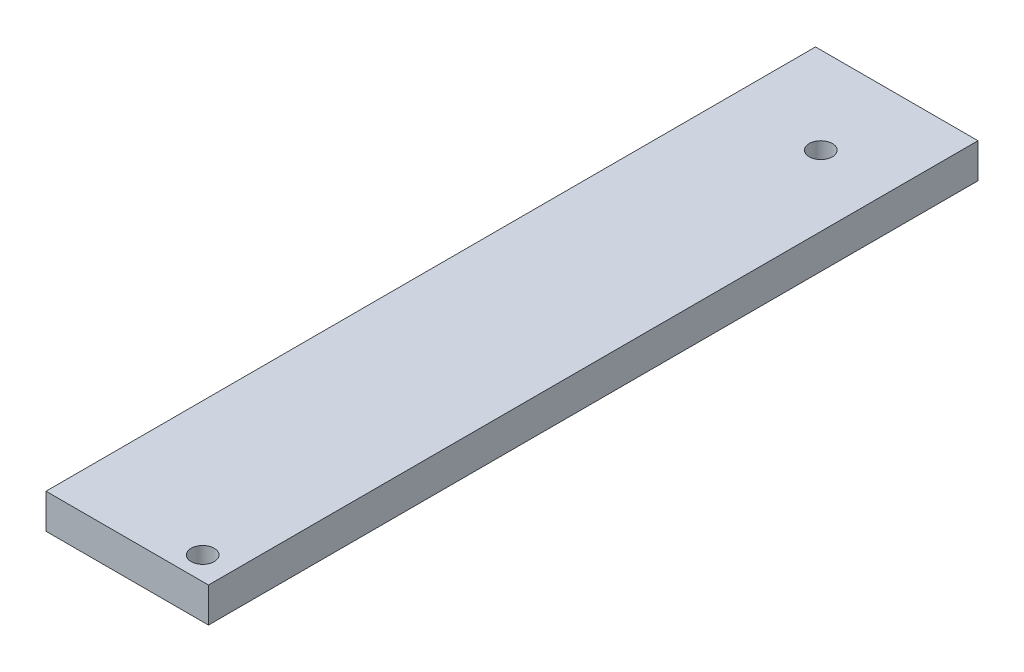
ISO-10303-21;
HEADER;
FILE_DESCRIPTION(('STEP AP214'),'2;1');
FILE_NAME('part.step','',(''),(''),'','','');
FILE_SCHEMA(('AUTOMOTIVE_DESIGN { 1 0 10303 214 1 1 1 1 }'));
ENDSEC;
DATA;
#1=APPLICATION_CONTEXT('core data for automotive mechanical design processes');
#2=APPLICATION_PROTOCOL_DEFINITION('international standard','automotive_design',2000,#1);
#3=PRODUCT_CONTEXT('',#1,'mechanical');
#4=PRODUCT('Part','Part','',(#3));
#5=PRODUCT_RELATED_PRODUCT_CATEGORY('part','',(#4));
#6=PRODUCT_DEFINITION_FORMATION('','',#4);
#7=PRODUCT_DEFINITION_CONTEXT('part definition',#1,'design');
#8=PRODUCT_DEFINITION('design','',#6,#7);
#9=PRODUCT_DEFINITION_SHAPE('','',#8);
#10=(LENGTH_UNIT() NAMED_UNIT(*) SI_UNIT(.MILLI.,.METRE.));
#11=(NAMED_UNIT(*) PLANE_ANGLE_UNIT() SI_UNIT($,.RADIAN.));
#12=(NAMED_UNIT(*) SI_UNIT($,.STERADIAN.) SOLID_ANGLE_UNIT());
#13=UNCERTAINTY_MEASURE_WITH_UNIT(LENGTH_MEASURE(1.E-05),#10,'distance_accuracy_value','');
#14=(GEOMETRIC_REPRESENTATION_CONTEXT(3) GLOBAL_UNCERTAINTY_ASSIGNED_CONTEXT((#13)) GLOBAL_UNIT_ASSIGNED_CONTEXT((#10,
#11,#12)) REPRESENTATION_CONTEXT('',''));
#15=CARTESIAN_POINT('',(0.,0.,0.));
#16=DIRECTION('',(0.,0.,1.));
#17=DIRECTION('',(1.,0.,0.));
#18=AXIS2_PLACEMENT_3D('',#15,#16,#17);
#19=CARTESIAN_POINT('',(11.6837837837838,6.,0.));
#20=DIRECTION('',(1.,0.,0.));
#21=DIRECTION('',(0.,0.,-1.));
#22=AXIS2_PLACEMENT_3D('',#19,#20,#21);
#23=PLANE('',#22);
#24=DIRECTION('',(0.,0.,1.));
#25=VECTOR('',#24,1.);
#26=CARTESIAN_POINT('',(11.6837837837838,0.,0.));
#27=LINE('',#26,#25);
#28=CARTESIAN_POINT('',(11.6837837837838,0.,-61.6054054054054));
#29=VERTEX_POINT('',#28);
#30=CARTESIAN_POINT('',(11.6837837837838,0.,71.3945945945946));
#31=VERTEX_POINT('',#30);
#32=EDGE_CURVE('E99',#29,#31,#27,.T.);
#33=ORIENTED_EDGE('',*,*,#32,.F.);
#34=DIRECTION('',(0.,-1.,0.));
#35=VECTOR('',#34,1.);
#36=CARTESIAN_POINT('',(11.6837837837838,6.,-61.6054054054054));
#37=LINE('',#36,#35);
#38=CARTESIAN_POINT('',(11.6837837837838,6.,-61.6054054054054));
#39=VERTEX_POINT('',#38);
#40=EDGE_CURVE('E11',#39,#29,#37,.T.);
#41=ORIENTED_EDGE('',*,*,#40,.F.);
#42=DIRECTION('',(0.,0.,1.));
#43=VECTOR('',#42,1.);
#44=CARTESIAN_POINT('',(11.6837837837838,6.,0.));
#45=LINE('',#44,#43);
#46=CARTESIAN_POINT('',(11.6837837837838,6.,71.3945945945946));
#47=VERTEX_POINT('',#46);
#48=EDGE_CURVE('E92',#39,#47,#45,.T.);
#49=ORIENTED_EDGE('',*,*,#48,.T.);
#50=DIRECTION('',(0.,-1.,0.));
#51=VECTOR('',#50,1.);
#52=CARTESIAN_POINT('',(11.6837837837838,6.,71.3945945945946));
#53=LINE('',#52,#51);
#54=EDGE_CURVE('E73',#47,#31,#53,.T.);
#55=ORIENTED_EDGE('',*,*,#54,.T.);
#56=EDGE_LOOP('',(#33,#41,#49,#55));
#57=FACE_BOUND('',#56,.T.);
#58=ADVANCED_FACE('F35',(#57),#23,.T.);
#59=CARTESIAN_POINT('',(0.,6.,-61.6054054054054));
#60=DIRECTION('',(0.,0.,-1.));
#61=DIRECTION('',(-1.,0.,0.));
#62=AXIS2_PLACEMENT_3D('',#59,#60,#61);
#63=PLANE('',#62);
#64=DIRECTION('',(1.,0.,0.));
#65=VECTOR('',#64,1.);
#66=CARTESIAN_POINT('',(0.,0.,-61.6054054054054));
#67=LINE('',#66,#65);
#68=CARTESIAN_POINT('',(-16.3962162162162,0.,-61.6054054054054));
#69=VERTEX_POINT('',#68);
#70=EDGE_CURVE('E86',#69,#29,#67,.T.);
#71=ORIENTED_EDGE('',*,*,#70,.F.);
#72=DIRECTION('',(0.,-1.,0.));
#73=VECTOR('',#72,1.);
#74=CARTESIAN_POINT('',(-16.3962162162162,6.,-61.6054054054054));
#75=LINE('',#74,#73);
#76=CARTESIAN_POINT('',(-16.3962162162162,6.,-61.6054054054054));
#77=VERTEX_POINT('',#76);
#78=EDGE_CURVE('E43',#77,#69,#75,.T.);
#79=ORIENTED_EDGE('',*,*,#78,.F.);
#80=DIRECTION('',(1.,0.,0.));
#81=VECTOR('',#80,1.);
#82=CARTESIAN_POINT('',(0.,6.,-61.6054054054054));
#83=LINE('',#82,#81);
#84=EDGE_CURVE('E84',#77,#39,#83,.T.);
#85=ORIENTED_EDGE('',*,*,#84,.T.);
#86=ORIENTED_EDGE('',*,*,#40,.T.);
#87=EDGE_LOOP('',(#71,#79,#85,#86));
#88=FACE_BOUND('',#87,.T.);
#89=ADVANCED_FACE('F82',(#88),#63,.T.);
#90=CARTESIAN_POINT('',(-16.3962162162162,6.,0.));
#91=DIRECTION('',(1.,0.,0.));
#92=DIRECTION('',(0.,0.,-1.));
#93=AXIS2_PLACEMENT_3D('',#90,#91,#92);
#94=PLANE('',#93);
#95=DIRECTION('',(0.,0.,1.));
#96=VECTOR('',#95,1.);
#97=CARTESIAN_POINT('',(-16.3962162162162,0.,0.));
#98=LINE('',#97,#96);
#99=CARTESIAN_POINT('',(-16.3962162162162,0.,71.3945945945946));
#100=VERTEX_POINT('',#99);
#101=EDGE_CURVE('E66',#69,#100,#98,.T.);
#102=ORIENTED_EDGE('',*,*,#101,.T.);
#103=DIRECTION('',(0.,-1.,0.));
#104=VECTOR('',#103,1.);
#105=CARTESIAN_POINT('',(-16.3962162162162,6.,71.3945945945946));
#106=LINE('',#105,#104);
#107=CARTESIAN_POINT('',(-16.3962162162162,6.,71.3945945945946));
#108=VERTEX_POINT('',#107);
#109=EDGE_CURVE('E87',#108,#100,#106,.T.);
#110=ORIENTED_EDGE('',*,*,#109,.F.);
#111=DIRECTION('',(0.,0.,1.));
#112=VECTOR('',#111,1.);
#113=CARTESIAN_POINT('',(-16.3962162162162,6.,0.));
#114=LINE('',#113,#112);
#115=EDGE_CURVE('E88',#77,#108,#114,.T.);
#116=ORIENTED_EDGE('',*,*,#115,.F.);
#117=ORIENTED_EDGE('',*,*,#78,.T.);
#118=EDGE_LOOP('',(#102,#110,#116,#117));
#119=FACE_BOUND('',#118,.T.);
#120=ADVANCED_FACE('F89',(#119),#94,.F.);
#121=CARTESIAN_POINT('',(0.,6.,71.3945945945946));
#122=DIRECTION('',(0.,0.,-1.));
#123=DIRECTION('',(-1.,0.,0.));
#124=AXIS2_PLACEMENT_3D('',#121,#122,#123);
#125=PLANE('',#124);
#126=DIRECTION('',(1.,0.,0.));
#127=VECTOR('',#126,1.);
#128=CARTESIAN_POINT('',(0.,0.,71.3945945945946));
#129=LINE('',#128,#127);
#130=EDGE_CURVE('E94',#100,#31,#129,.T.);
#131=ORIENTED_EDGE('',*,*,#130,.T.);
#132=ORIENTED_EDGE('',*,*,#54,.F.);
#133=DIRECTION('',(1.,0.,0.));
#134=VECTOR('',#133,1.);
#135=CARTESIAN_POINT('',(0.,6.,71.3945945945946));
#136=LINE('',#135,#134);
#137=EDGE_CURVE('E51',#108,#47,#136,.T.);
#138=ORIENTED_EDGE('',*,*,#137,.F.);
#139=ORIENTED_EDGE('',*,*,#109,.T.);
#140=EDGE_LOOP('',(#131,#132,#138,#139));
#141=FACE_BOUND('',#140,.T.);
#142=ADVANCED_FACE('F109',(#141),#125,.F.);
#143=CARTESIAN_POINT('',(0.,6.,0.));
#144=DIRECTION('',(0.,1.,0.));
#145=DIRECTION('',(0.,0.,1.));
#146=AXIS2_PLACEMENT_3D('',#143,#144,#145);
#147=PLANE('',#146);
#148=CARTESIAN_POINT('',(6.68378378378379,6.,67.3945945945946));
#149=DIRECTION('',(0.,-1.,0.));
#150=DIRECTION('',(0.,0.,-1.));
#151=AXIS2_PLACEMENT_3D('',#148,#149,#150);
#152=CIRCLE('',#151,2.);
#153=CARTESIAN_POINT('',(6.68378378378379,6.,65.3945945945946));
#154=VERTEX_POINT('',#153);
#155=EDGE_CURVE('E141',#154,#154,#152,.T.);
#156=ORIENTED_EDGE('',*,*,#155,.T.);
#157=EDGE_LOOP('',(#156));
#158=FACE_BOUND('',#157,.T.);
#159=CARTESIAN_POINT('',(-0.486216216216247,6.,-46.6054054054054));
#160=DIRECTION('',(0.,1.,0.));
#161=DIRECTION('',(0.,0.,1.));
#162=AXIS2_PLACEMENT_3D('',#159,#160,#161);
#163=CIRCLE('',#162,2.);
#164=CARTESIAN_POINT('',(-0.486216216216247,6.,-44.6054054054054));
#165=VERTEX_POINT('',#164);
#166=EDGE_CURVE('E146',#165,#165,#163,.T.);
#167=ORIENTED_EDGE('',*,*,#166,.F.);
#168=EDGE_LOOP('',(#167));
#169=FACE_BOUND('',#168,.T.);
#170=ORIENTED_EDGE('',*,*,#48,.F.);
#171=ORIENTED_EDGE('',*,*,#84,.F.);
#172=ORIENTED_EDGE('',*,*,#115,.T.);
#173=ORIENTED_EDGE('',*,*,#137,.T.);
#174=EDGE_LOOP('',(#170,#171,#172,#173));
#175=FACE_BOUND('',#174,.T.);
#176=ADVANCED_FACE('F91',(#158,#169,#175),#147,.T.);
#177=CARTESIAN_POINT('',(0.,0.,0.));
#178=DIRECTION('',(0.,1.,0.));
#179=DIRECTION('',(0.,0.,1.));
#180=AXIS2_PLACEMENT_3D('',#177,#178,#179);
#181=PLANE('',#180);
#182=CARTESIAN_POINT('',(6.68378378378379,0.,67.3945945945946));
#183=DIRECTION('',(0.,-1.,0.));
#184=DIRECTION('',(0.,0.,-1.));
#185=AXIS2_PLACEMENT_3D('',#182,#183,#184);
#186=CIRCLE('',#185,2.);
#187=CARTESIAN_POINT('',(6.68378378378379,0.,65.3945945945946));
#188=VERTEX_POINT('',#187);
#189=EDGE_CURVE('E144',#188,#188,#186,.T.);
#190=ORIENTED_EDGE('',*,*,#189,.F.);
#191=EDGE_LOOP('',(#190));
#192=FACE_BOUND('',#191,.T.);
#193=CARTESIAN_POINT('',(-0.486216216216247,0.,-46.6054054054054));
#194=DIRECTION('',(0.,1.,0.));
#195=DIRECTION('',(0.,0.,1.));
#196=AXIS2_PLACEMENT_3D('',#193,#194,#195);
#197=CIRCLE('',#196,2.);
#198=CARTESIAN_POINT('',(-0.486216216216247,0.,-44.6054054054054));
#199=VERTEX_POINT('',#198);
#200=EDGE_CURVE('E102',#199,#199,#197,.T.);
#201=ORIENTED_EDGE('',*,*,#200,.T.);
#202=EDGE_LOOP('',(#201));
#203=FACE_BOUND('',#202,.T.);
#204=ORIENTED_EDGE('',*,*,#32,.T.);
#205=ORIENTED_EDGE('',*,*,#130,.F.);
#206=ORIENTED_EDGE('',*,*,#101,.F.);
#207=ORIENTED_EDGE('',*,*,#70,.T.);
#208=EDGE_LOOP('',(#204,#205,#206,#207));
#209=FACE_BOUND('',#208,.T.);
#210=ADVANCED_FACE('F111',(#192,#203,#209),#181,.F.);
#211=CARTESIAN_POINT('',(-0.486216216216247,0.,-46.6054054054054));
#212=DIRECTION('',(0.,1.,0.));
#213=DIRECTION('',(0.,0.,1.));
#214=AXIS2_PLACEMENT_3D('',#211,#212,#213);
#215=CYLINDRICAL_SURFACE('',#214,2.);
#216=ORIENTED_EDGE('',*,*,#200,.F.);
#217=EDGE_LOOP('',(#216));
#218=FACE_BOUND('',#217,.T.);
#219=ORIENTED_EDGE('',*,*,#166,.T.);
#220=EDGE_LOOP('',(#219));
#221=FACE_BOUND('',#220,.T.);
#222=ADVANCED_FACE('F125',(#218,#221),#215,.F.);
#223=CARTESIAN_POINT('',(6.68378378378379,6.,67.3945945945946));
#224=DIRECTION('',(0.,-1.,0.));
#225=DIRECTION('',(0.,0.,-1.));
#226=AXIS2_PLACEMENT_3D('',#223,#224,#225);
#227=CYLINDRICAL_SURFACE('',#226,2.);
#228=ORIENTED_EDGE('',*,*,#155,.F.);
#229=EDGE_LOOP('',(#228));
#230=FACE_BOUND('',#229,.T.);
#231=ORIENTED_EDGE('',*,*,#189,.T.);
#232=EDGE_LOOP('',(#231));
#233=FACE_BOUND('',#232,.T.);
#234=ADVANCED_FACE('F132',(#230,#233),#227,.F.);
#235=CLOSED_SHELL('',(#58,#89,#120,#142,#176,#210,#222,#234));
#236=MANIFOLD_SOLID_BREP('B2',#235);
#237=ADVANCED_BREP_SHAPE_REPRESENTATION('',(#18,#236),#14);
#238=SHAPE_DEFINITION_REPRESENTATION(#9,#237);
ENDSEC;
END-ISO-10303-21;
